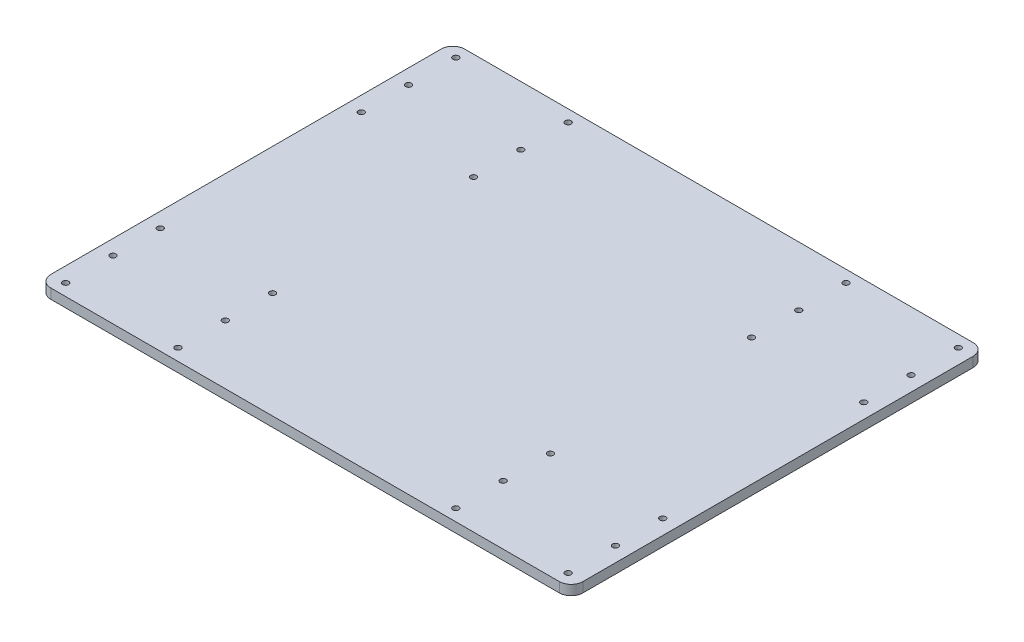
ISO-10303-21;
HEADER;
FILE_DESCRIPTION(('STEP AP214'),'2;1');
FILE_NAME('part.step','',(''),(''),'','','');
FILE_SCHEMA(('AUTOMOTIVE_DESIGN { 1 0 10303 214 1 1 1 1 }'));
ENDSEC;
DATA;
#1=APPLICATION_CONTEXT('core data for automotive mechanical design processes');
#2=APPLICATION_PROTOCOL_DEFINITION('international standard','automotive_design',2000,#1);
#3=PRODUCT_CONTEXT('',#1,'mechanical');
#4=PRODUCT('Part','Part','',(#3));
#5=PRODUCT_RELATED_PRODUCT_CATEGORY('part','',(#4));
#6=PRODUCT_DEFINITION_FORMATION('','',#4);
#7=PRODUCT_DEFINITION_CONTEXT('part definition',#1,'design');
#8=PRODUCT_DEFINITION('design','',#6,#7);
#9=PRODUCT_DEFINITION_SHAPE('','',#8);
#10=(LENGTH_UNIT() NAMED_UNIT(*) SI_UNIT(.MILLI.,.METRE.));
#11=(NAMED_UNIT(*) PLANE_ANGLE_UNIT() SI_UNIT($,.RADIAN.));
#12=(NAMED_UNIT(*) SI_UNIT($,.STERADIAN.) SOLID_ANGLE_UNIT());
#13=UNCERTAINTY_MEASURE_WITH_UNIT(LENGTH_MEASURE(1.E-05),#10,'distance_accuracy_value','');
#14=(GEOMETRIC_REPRESENTATION_CONTEXT(3) GLOBAL_UNCERTAINTY_ASSIGNED_CONTEXT((#13)) GLOBAL_UNIT_ASSIGNED_CONTEXT((#10,
#11,#12)) REPRESENTATION_CONTEXT('',''));
#15=CARTESIAN_POINT('',(0.,0.,0.));
#16=DIRECTION('',(0.,0.,1.));
#17=DIRECTION('',(1.,0.,0.));
#18=AXIS2_PLACEMENT_3D('',#15,#16,#17);
#19=CARTESIAN_POINT('',(129.,5.,-99.));
#20=DIRECTION('',(0.,-1.,0.));
#21=DIRECTION('',(0.,0.,-1.));
#22=AXIS2_PLACEMENT_3D('',#19,#20,#21);
#23=PLANE('',#22);
#24=CARTESIAN_POINT('',(129.,5.,-99.));
#25=DIRECTION('',(0.,1.,0.));
#26=DIRECTION('',(0.,0.,-1.));
#27=AXIS2_PLACEMENT_3D('',#24,#25,#26);
#28=CIRCLE('',#27,5.99999999999998);
#29=CARTESIAN_POINT('',(135.,5.,-99.));
#30=VERTEX_POINT('',#29);
#31=CARTESIAN_POINT('',(129.,5.,-105.));
#32=VERTEX_POINT('',#31);
#33=EDGE_CURVE('E151',#30,#32,#28,.T.);
#34=ORIENTED_EDGE('',*,*,#33,.T.);
#35=DIRECTION('',(-1.,0.,0.));
#36=VECTOR('',#35,1.);
#37=CARTESIAN_POINT('',(-129.,5.,-105.));
#38=LINE('',#37,#36);
#39=CARTESIAN_POINT('',(-129.,5.,-105.));
#40=VERTEX_POINT('',#39);
#41=EDGE_CURVE('E99',#32,#40,#38,.T.);
#42=ORIENTED_EDGE('',*,*,#41,.T.);
#43=CARTESIAN_POINT('',(-129.,5.,-99.));
#44=DIRECTION('',(0.,1.,0.));
#45=DIRECTION('',(0.,0.,-1.));
#46=AXIS2_PLACEMENT_3D('',#43,#44,#45);
#47=CIRCLE('',#46,5.99999999999998);
#48=CARTESIAN_POINT('',(-135.,5.,-99.));
#49=VERTEX_POINT('',#48);
#50=EDGE_CURVE('E166',#40,#49,#47,.T.);
#51=ORIENTED_EDGE('',*,*,#50,.T.);
#52=DIRECTION('',(0.,0.,1.));
#53=VECTOR('',#52,1.);
#54=CARTESIAN_POINT('',(-135.,5.,99.));
#55=LINE('',#54,#53);
#56=CARTESIAN_POINT('',(-135.,5.,99.));
#57=VERTEX_POINT('',#56);
#58=EDGE_CURVE('E179',#49,#57,#55,.T.);
#59=ORIENTED_EDGE('',*,*,#58,.T.);
#60=CARTESIAN_POINT('',(-129.,5.,99.));
#61=DIRECTION('',(0.,1.,0.));
#62=DIRECTION('',(0.,0.,-1.));
#63=AXIS2_PLACEMENT_3D('',#60,#61,#62);
#64=CIRCLE('',#63,5.99999999999996);
#65=CARTESIAN_POINT('',(-129.,5.,105.));
#66=VERTEX_POINT('',#65);
#67=EDGE_CURVE('E118',#57,#66,#64,.T.);
#68=ORIENTED_EDGE('',*,*,#67,.T.);
#69=DIRECTION('',(1.,0.,0.));
#70=VECTOR('',#69,1.);
#71=CARTESIAN_POINT('',(-129.,5.,105.));
#72=LINE('',#71,#70);
#73=CARTESIAN_POINT('',(129.,5.,105.));
#74=VERTEX_POINT('',#73);
#75=EDGE_CURVE('E112',#66,#74,#72,.T.);
#76=ORIENTED_EDGE('',*,*,#75,.T.);
#77=CARTESIAN_POINT('',(129.,5.,99.));
#78=DIRECTION('',(0.,1.,0.));
#79=DIRECTION('',(0.,0.,-1.));
#80=AXIS2_PLACEMENT_3D('',#77,#78,#79);
#81=CIRCLE('',#80,5.99999999999998);
#82=CARTESIAN_POINT('',(135.,5.,99.));
#83=VERTEX_POINT('',#82);
#84=EDGE_CURVE('E116',#74,#83,#81,.T.);
#85=ORIENTED_EDGE('',*,*,#84,.T.);
#86=DIRECTION('',(0.,0.,-1.));
#87=VECTOR('',#86,1.);
#88=CARTESIAN_POINT('',(135.,5.,99.));
#89=LINE('',#88,#87);
#90=EDGE_CURVE('E56',#83,#30,#89,.T.);
#91=ORIENTED_EDGE('',*,*,#90,.T.);
#92=EDGE_LOOP('',(#34,#42,#51,#59,#68,#76,#85,#91));
#93=FACE_BOUND('',#92,.T.);
#94=CARTESIAN_POINT('',(-127.5,5.,-99.));
#95=DIRECTION('',(0.,1.,0.));
#96=DIRECTION('',(0.,0.,1.));
#97=AXIS2_PLACEMENT_3D('',#94,#95,#96);
#98=CIRCLE('',#97,1.5);
#99=CARTESIAN_POINT('',(-127.5,5.,-97.5));
#100=VERTEX_POINT('',#99);
#101=EDGE_CURVE('E140',#100,#100,#98,.T.);
#102=ORIENTED_EDGE('',*,*,#101,.F.);
#103=EDGE_LOOP('',(#102));
#104=FACE_BOUND('',#103,.T.);
#105=CARTESIAN_POINT('',(-127.5,5.,-75.));
#106=DIRECTION('',(0.,1.,0.));
#107=DIRECTION('',(0.,0.,1.));
#108=AXIS2_PLACEMENT_3D('',#105,#106,#107);
#109=CIRCLE('',#108,1.5);
#110=CARTESIAN_POINT('',(-127.5,5.,-73.5));
#111=VERTEX_POINT('',#110);
#112=EDGE_CURVE('E188',#111,#111,#109,.T.);
#113=ORIENTED_EDGE('',*,*,#112,.F.);
#114=EDGE_LOOP('',(#113));
#115=FACE_BOUND('',#114,.T.);
#116=CARTESIAN_POINT('',(-127.5,5.,-51.));
#117=DIRECTION('',(0.,1.,0.));
#118=DIRECTION('',(0.,0.,1.));
#119=AXIS2_PLACEMENT_3D('',#116,#117,#118);
#120=CIRCLE('',#119,1.5);
#121=CARTESIAN_POINT('',(-127.5,5.,-49.5));
#122=VERTEX_POINT('',#121);
#123=EDGE_CURVE('E194',#122,#122,#120,.T.);
#124=ORIENTED_EDGE('',*,*,#123,.F.);
#125=EDGE_LOOP('',(#124));
#126=FACE_BOUND('',#125,.T.);
#127=CARTESIAN_POINT('',(-70.5,5.,-99.));
#128=DIRECTION('',(0.,1.,0.));
#129=DIRECTION('',(0.,0.,1.));
#130=AXIS2_PLACEMENT_3D('',#127,#128,#129);
#131=CIRCLE('',#130,1.5);
#132=CARTESIAN_POINT('',(-70.5,5.,-97.5));
#133=VERTEX_POINT('',#132);
#134=EDGE_CURVE('E200',#133,#133,#131,.T.);
#135=ORIENTED_EDGE('',*,*,#134,.F.);
#136=EDGE_LOOP('',(#135));
#137=FACE_BOUND('',#136,.T.);
#138=CARTESIAN_POINT('',(-70.4999999999998,5.,-75.));
#139=DIRECTION('',(0.,1.,0.));
#140=DIRECTION('',(0.,0.,1.));
#141=AXIS2_PLACEMENT_3D('',#138,#139,#140);
#142=CIRCLE('',#141,1.5);
#143=CARTESIAN_POINT('',(-70.4999999999998,5.,-73.5));
#144=VERTEX_POINT('',#143);
#145=EDGE_CURVE('E206',#144,#144,#142,.T.);
#146=ORIENTED_EDGE('',*,*,#145,.F.);
#147=EDGE_LOOP('',(#146));
#148=FACE_BOUND('',#147,.T.);
#149=CARTESIAN_POINT('',(-70.4999999999995,5.,-51.));
#150=DIRECTION('',(0.,1.,0.));
#151=DIRECTION('',(0.,0.,1.));
#152=AXIS2_PLACEMENT_3D('',#149,#150,#151);
#153=CIRCLE('',#152,1.5);
#154=CARTESIAN_POINT('',(-70.4999999999995,5.,-49.5));
#155=VERTEX_POINT('',#154);
#156=EDGE_CURVE('E212',#155,#155,#153,.T.);
#157=ORIENTED_EDGE('',*,*,#156,.F.);
#158=EDGE_LOOP('',(#157));
#159=FACE_BOUND('',#158,.T.);
#160=CARTESIAN_POINT('',(70.4999999999995,5.,-51.));
#161=DIRECTION('',(0.,1.,0.));
#162=DIRECTION('',(0.,0.,-1.));
#163=AXIS2_PLACEMENT_3D('',#160,#161,#162);
#164=CIRCLE('',#163,1.5);
#165=CARTESIAN_POINT('',(70.4999999999995,5.,-52.5));
#166=VERTEX_POINT('',#165);
#167=EDGE_CURVE('E218',#166,#166,#164,.T.);
#168=ORIENTED_EDGE('',*,*,#167,.F.);
#169=EDGE_LOOP('',(#168));
#170=FACE_BOUND('',#169,.T.);
#171=CARTESIAN_POINT('',(70.4999999999998,5.,-75.));
#172=DIRECTION('',(0.,1.,0.));
#173=DIRECTION('',(0.,0.,-1.));
#174=AXIS2_PLACEMENT_3D('',#171,#172,#173);
#175=CIRCLE('',#174,1.5);
#176=CARTESIAN_POINT('',(70.4999999999998,5.,-76.5));
#177=VERTEX_POINT('',#176);
#178=EDGE_CURVE('E224',#177,#177,#175,.T.);
#179=ORIENTED_EDGE('',*,*,#178,.F.);
#180=EDGE_LOOP('',(#179));
#181=FACE_BOUND('',#180,.T.);
#182=CARTESIAN_POINT('',(70.5,5.,-99.));
#183=DIRECTION('',(0.,1.,0.));
#184=DIRECTION('',(0.,0.,-1.));
#185=AXIS2_PLACEMENT_3D('',#182,#183,#184);
#186=CIRCLE('',#185,1.5);
#187=CARTESIAN_POINT('',(70.5,5.,-100.5));
#188=VERTEX_POINT('',#187);
#189=EDGE_CURVE('E230',#188,#188,#186,.T.);
#190=ORIENTED_EDGE('',*,*,#189,.F.);
#191=EDGE_LOOP('',(#190));
#192=FACE_BOUND('',#191,.T.);
#193=CARTESIAN_POINT('',(127.5,5.,-51.));
#194=DIRECTION('',(0.,1.,0.));
#195=DIRECTION('',(0.,0.,-1.));
#196=AXIS2_PLACEMENT_3D('',#193,#194,#195);
#197=CIRCLE('',#196,1.5);
#198=CARTESIAN_POINT('',(127.5,5.,-52.5));
#199=VERTEX_POINT('',#198);
#200=EDGE_CURVE('E236',#199,#199,#197,.T.);
#201=ORIENTED_EDGE('',*,*,#200,.F.);
#202=EDGE_LOOP('',(#201));
#203=FACE_BOUND('',#202,.T.);
#204=CARTESIAN_POINT('',(127.5,5.,-75.));
#205=DIRECTION('',(0.,1.,0.));
#206=DIRECTION('',(0.,0.,-1.));
#207=AXIS2_PLACEMENT_3D('',#204,#205,#206);
#208=CIRCLE('',#207,1.5);
#209=CARTESIAN_POINT('',(127.5,5.,-76.5));
#210=VERTEX_POINT('',#209);
#211=EDGE_CURVE('E242',#210,#210,#208,.T.);
#212=ORIENTED_EDGE('',*,*,#211,.F.);
#213=EDGE_LOOP('',(#212));
#214=FACE_BOUND('',#213,.T.);
#215=CARTESIAN_POINT('',(127.5,5.,-99.));
#216=DIRECTION('',(0.,1.,0.));
#217=DIRECTION('',(0.,0.,-1.));
#218=AXIS2_PLACEMENT_3D('',#215,#216,#217);
#219=CIRCLE('',#218,1.5);
#220=CARTESIAN_POINT('',(127.5,5.,-100.5));
#221=VERTEX_POINT('',#220);
#222=EDGE_CURVE('E248',#221,#221,#219,.T.);
#223=ORIENTED_EDGE('',*,*,#222,.F.);
#224=EDGE_LOOP('',(#223));
#225=FACE_BOUND('',#224,.T.);
#226=CARTESIAN_POINT('',(127.5,5.,99.));
#227=DIRECTION('',(0.,1.,0.));
#228=DIRECTION('',(0.,0.,1.));
#229=AXIS2_PLACEMENT_3D('',#226,#227,#228);
#230=CIRCLE('',#229,1.5);
#231=CARTESIAN_POINT('',(127.5,5.,100.5));
#232=VERTEX_POINT('',#231);
#233=EDGE_CURVE('E254',#232,#232,#230,.T.);
#234=ORIENTED_EDGE('',*,*,#233,.F.);
#235=EDGE_LOOP('',(#234));
#236=FACE_BOUND('',#235,.T.);
#237=CARTESIAN_POINT('',(127.5,5.,75.));
#238=DIRECTION('',(0.,1.,0.));
#239=DIRECTION('',(0.,0.,1.));
#240=AXIS2_PLACEMENT_3D('',#237,#238,#239);
#241=CIRCLE('',#240,1.5);
#242=CARTESIAN_POINT('',(127.5,5.,76.5));
#243=VERTEX_POINT('',#242);
#244=EDGE_CURVE('E260',#243,#243,#241,.T.);
#245=ORIENTED_EDGE('',*,*,#244,.F.);
#246=EDGE_LOOP('',(#245));
#247=FACE_BOUND('',#246,.T.);
#248=CARTESIAN_POINT('',(127.5,5.,51.));
#249=DIRECTION('',(0.,1.,0.));
#250=DIRECTION('',(0.,0.,1.));
#251=AXIS2_PLACEMENT_3D('',#248,#249,#250);
#252=CIRCLE('',#251,1.5);
#253=CARTESIAN_POINT('',(127.5,5.,52.5));
#254=VERTEX_POINT('',#253);
#255=EDGE_CURVE('E266',#254,#254,#252,.T.);
#256=ORIENTED_EDGE('',*,*,#255,.F.);
#257=EDGE_LOOP('',(#256));
#258=FACE_BOUND('',#257,.T.);
#259=CARTESIAN_POINT('',(70.5,5.,99.));
#260=DIRECTION('',(0.,1.,0.));
#261=DIRECTION('',(0.,0.,1.));
#262=AXIS2_PLACEMENT_3D('',#259,#260,#261);
#263=CIRCLE('',#262,1.5);
#264=CARTESIAN_POINT('',(70.5,5.,100.5));
#265=VERTEX_POINT('',#264);
#266=EDGE_CURVE('E272',#265,#265,#263,.T.);
#267=ORIENTED_EDGE('',*,*,#266,.F.);
#268=EDGE_LOOP('',(#267));
#269=FACE_BOUND('',#268,.T.);
#270=CARTESIAN_POINT('',(70.4999999999998,5.,75.));
#271=DIRECTION('',(0.,1.,0.));
#272=DIRECTION('',(0.,0.,1.));
#273=AXIS2_PLACEMENT_3D('',#270,#271,#272);
#274=CIRCLE('',#273,1.5);
#275=CARTESIAN_POINT('',(70.4999999999998,5.,76.5));
#276=VERTEX_POINT('',#275);
#277=EDGE_CURVE('E278',#276,#276,#274,.T.);
#278=ORIENTED_EDGE('',*,*,#277,.F.);
#279=EDGE_LOOP('',(#278));
#280=FACE_BOUND('',#279,.T.);
#281=CARTESIAN_POINT('',(70.4999999999995,5.,51.));
#282=DIRECTION('',(0.,1.,0.));
#283=DIRECTION('',(0.,0.,1.));
#284=AXIS2_PLACEMENT_3D('',#281,#282,#283);
#285=CIRCLE('',#284,1.5);
#286=CARTESIAN_POINT('',(70.4999999999995,5.,52.5));
#287=VERTEX_POINT('',#286);
#288=EDGE_CURVE('E284',#287,#287,#285,.T.);
#289=ORIENTED_EDGE('',*,*,#288,.F.);
#290=EDGE_LOOP('',(#289));
#291=FACE_BOUND('',#290,.T.);
#292=CARTESIAN_POINT('',(-70.4999999999995,5.,51.));
#293=DIRECTION('',(0.,1.,0.));
#294=DIRECTION('',(0.,0.,-1.));
#295=AXIS2_PLACEMENT_3D('',#292,#293,#294);
#296=CIRCLE('',#295,1.5);
#297=CARTESIAN_POINT('',(-70.4999999999995,5.,49.5));
#298=VERTEX_POINT('',#297);
#299=EDGE_CURVE('E290',#298,#298,#296,.T.);
#300=ORIENTED_EDGE('',*,*,#299,.F.);
#301=EDGE_LOOP('',(#300));
#302=FACE_BOUND('',#301,.T.);
#303=CARTESIAN_POINT('',(-70.4999999999998,5.,75.));
#304=DIRECTION('',(0.,1.,0.));
#305=DIRECTION('',(0.,0.,-1.));
#306=AXIS2_PLACEMENT_3D('',#303,#304,#305);
#307=CIRCLE('',#306,1.5);
#308=CARTESIAN_POINT('',(-70.4999999999998,5.,73.5));
#309=VERTEX_POINT('',#308);
#310=EDGE_CURVE('E296',#309,#309,#307,.T.);
#311=ORIENTED_EDGE('',*,*,#310,.F.);
#312=EDGE_LOOP('',(#311));
#313=FACE_BOUND('',#312,.T.);
#314=CARTESIAN_POINT('',(-70.5,5.,99.));
#315=DIRECTION('',(0.,1.,0.));
#316=DIRECTION('',(0.,0.,-1.));
#317=AXIS2_PLACEMENT_3D('',#314,#315,#316);
#318=CIRCLE('',#317,1.5);
#319=CARTESIAN_POINT('',(-70.5,5.,97.5));
#320=VERTEX_POINT('',#319);
#321=EDGE_CURVE('E302',#320,#320,#318,.T.);
#322=ORIENTED_EDGE('',*,*,#321,.F.);
#323=EDGE_LOOP('',(#322));
#324=FACE_BOUND('',#323,.T.);
#325=CARTESIAN_POINT('',(-127.5,5.,51.));
#326=DIRECTION('',(0.,1.,0.));
#327=DIRECTION('',(0.,0.,-1.));
#328=AXIS2_PLACEMENT_3D('',#325,#326,#327);
#329=CIRCLE('',#328,1.5);
#330=CARTESIAN_POINT('',(-127.5,5.,49.5));
#331=VERTEX_POINT('',#330);
#332=EDGE_CURVE('E308',#331,#331,#329,.T.);
#333=ORIENTED_EDGE('',*,*,#332,.F.);
#334=EDGE_LOOP('',(#333));
#335=FACE_BOUND('',#334,.T.);
#336=CARTESIAN_POINT('',(-127.5,5.,75.));
#337=DIRECTION('',(0.,1.,0.));
#338=DIRECTION('',(0.,0.,-1.));
#339=AXIS2_PLACEMENT_3D('',#336,#337,#338);
#340=CIRCLE('',#339,1.5);
#341=CARTESIAN_POINT('',(-127.5,5.,73.5));
#342=VERTEX_POINT('',#341);
#343=EDGE_CURVE('E314',#342,#342,#340,.T.);
#344=ORIENTED_EDGE('',*,*,#343,.F.);
#345=EDGE_LOOP('',(#344));
#346=FACE_BOUND('',#345,.T.);
#347=CARTESIAN_POINT('',(-127.5,5.,99.));
#348=DIRECTION('',(0.,1.,0.));
#349=DIRECTION('',(0.,0.,-1.));
#350=AXIS2_PLACEMENT_3D('',#347,#348,#349);
#351=CIRCLE('',#350,1.5);
#352=CARTESIAN_POINT('',(-127.5,5.,97.5));
#353=VERTEX_POINT('',#352);
#354=EDGE_CURVE('E320',#353,#353,#351,.T.);
#355=ORIENTED_EDGE('',*,*,#354,.F.);
#356=EDGE_LOOP('',(#355));
#357=FACE_BOUND('',#356,.T.);
#358=ADVANCED_FACE('F39',(#93,#104,#115,#126,#137,#148,#159,#170,#181,#192,#203,#214,#225,#236,
#247,#258,#269,#280,#291,#302,#313,#324,#335,#346,#357),#23,.F.);
#359=CARTESIAN_POINT('',(129.,0.,-99.));
#360=DIRECTION('',(0.,-1.,0.));
#361=DIRECTION('',(0.,0.,-1.));
#362=AXIS2_PLACEMENT_3D('',#359,#360,#361);
#363=PLANE('',#362);
#364=CARTESIAN_POINT('',(-127.5,0.,75.));
#365=DIRECTION('',(0.,1.,0.));
#366=DIRECTION('',(0.,0.,-1.));
#367=AXIS2_PLACEMENT_3D('',#364,#365,#366);
#368=CIRCLE('',#367,1.5);
#369=CARTESIAN_POINT('',(-127.5,0.,73.5));
#370=VERTEX_POINT('',#369);
#371=EDGE_CURVE('E317',#370,#370,#368,.T.);
#372=ORIENTED_EDGE('',*,*,#371,.T.);
#373=EDGE_LOOP('',(#372));
#374=FACE_BOUND('',#373,.T.);
#375=CARTESIAN_POINT('',(-70.5,0.,99.));
#376=DIRECTION('',(0.,1.,0.));
#377=DIRECTION('',(0.,0.,-1.));
#378=AXIS2_PLACEMENT_3D('',#375,#376,#377);
#379=CIRCLE('',#378,1.5);
#380=CARTESIAN_POINT('',(-70.5,0.,97.5));
#381=VERTEX_POINT('',#380);
#382=EDGE_CURVE('E305',#381,#381,#379,.T.);
#383=ORIENTED_EDGE('',*,*,#382,.T.);
#384=EDGE_LOOP('',(#383));
#385=FACE_BOUND('',#384,.T.);
#386=CARTESIAN_POINT('',(-70.4999999999995,0.,51.));
#387=DIRECTION('',(0.,1.,0.));
#388=DIRECTION('',(0.,0.,-1.));
#389=AXIS2_PLACEMENT_3D('',#386,#387,#388);
#390=CIRCLE('',#389,1.5);
#391=CARTESIAN_POINT('',(-70.4999999999995,0.,49.5));
#392=VERTEX_POINT('',#391);
#393=EDGE_CURVE('E293',#392,#392,#390,.T.);
#394=ORIENTED_EDGE('',*,*,#393,.T.);
#395=EDGE_LOOP('',(#394));
#396=FACE_BOUND('',#395,.T.);
#397=CARTESIAN_POINT('',(70.4999999999998,0.,75.));
#398=DIRECTION('',(0.,1.,0.));
#399=DIRECTION('',(0.,0.,1.));
#400=AXIS2_PLACEMENT_3D('',#397,#398,#399);
#401=CIRCLE('',#400,1.5);
#402=CARTESIAN_POINT('',(70.4999999999998,0.,76.5));
#403=VERTEX_POINT('',#402);
#404=EDGE_CURVE('E281',#403,#403,#401,.T.);
#405=ORIENTED_EDGE('',*,*,#404,.T.);
#406=EDGE_LOOP('',(#405));
#407=FACE_BOUND('',#406,.T.);
#408=CARTESIAN_POINT('',(127.5,0.,51.));
#409=DIRECTION('',(0.,1.,0.));
#410=DIRECTION('',(0.,0.,1.));
#411=AXIS2_PLACEMENT_3D('',#408,#409,#410);
#412=CIRCLE('',#411,1.5);
#413=CARTESIAN_POINT('',(127.5,0.,52.5));
#414=VERTEX_POINT('',#413);
#415=EDGE_CURVE('E269',#414,#414,#412,.T.);
#416=ORIENTED_EDGE('',*,*,#415,.T.);
#417=EDGE_LOOP('',(#416));
#418=FACE_BOUND('',#417,.T.);
#419=CARTESIAN_POINT('',(127.5,0.,99.));
#420=DIRECTION('',(0.,1.,0.));
#421=DIRECTION('',(0.,0.,1.));
#422=AXIS2_PLACEMENT_3D('',#419,#420,#421);
#423=CIRCLE('',#422,1.5);
#424=CARTESIAN_POINT('',(127.5,0.,100.5));
#425=VERTEX_POINT('',#424);
#426=EDGE_CURVE('E257',#425,#425,#423,.T.);
#427=ORIENTED_EDGE('',*,*,#426,.T.);
#428=EDGE_LOOP('',(#427));
#429=FACE_BOUND('',#428,.T.);
#430=CARTESIAN_POINT('',(127.5,0.,-75.));
#431=DIRECTION('',(0.,1.,0.));
#432=DIRECTION('',(0.,0.,-1.));
#433=AXIS2_PLACEMENT_3D('',#430,#431,#432);
#434=CIRCLE('',#433,1.5);
#435=CARTESIAN_POINT('',(127.5,0.,-76.5));
#436=VERTEX_POINT('',#435);
#437=EDGE_CURVE('E245',#436,#436,#434,.T.);
#438=ORIENTED_EDGE('',*,*,#437,.T.);
#439=EDGE_LOOP('',(#438));
#440=FACE_BOUND('',#439,.T.);
#441=CARTESIAN_POINT('',(70.5,0.,-99.));
#442=DIRECTION('',(0.,1.,0.));
#443=DIRECTION('',(0.,0.,-1.));
#444=AXIS2_PLACEMENT_3D('',#441,#442,#443);
#445=CIRCLE('',#444,1.5);
#446=CARTESIAN_POINT('',(70.5,0.,-100.5));
#447=VERTEX_POINT('',#446);
#448=EDGE_CURVE('E233',#447,#447,#445,.T.);
#449=ORIENTED_EDGE('',*,*,#448,.T.);
#450=EDGE_LOOP('',(#449));
#451=FACE_BOUND('',#450,.T.);
#452=CARTESIAN_POINT('',(70.4999999999995,0.,-51.));
#453=DIRECTION('',(0.,1.,0.));
#454=DIRECTION('',(0.,0.,-1.));
#455=AXIS2_PLACEMENT_3D('',#452,#453,#454);
#456=CIRCLE('',#455,1.5);
#457=CARTESIAN_POINT('',(70.4999999999995,0.,-52.5));
#458=VERTEX_POINT('',#457);
#459=EDGE_CURVE('E221',#458,#458,#456,.T.);
#460=ORIENTED_EDGE('',*,*,#459,.T.);
#461=EDGE_LOOP('',(#460));
#462=FACE_BOUND('',#461,.T.);
#463=CARTESIAN_POINT('',(-70.4999999999998,0.,-75.));
#464=DIRECTION('',(0.,1.,0.));
#465=DIRECTION('',(0.,0.,1.));
#466=AXIS2_PLACEMENT_3D('',#463,#464,#465);
#467=CIRCLE('',#466,1.5);
#468=CARTESIAN_POINT('',(-70.4999999999998,0.,-73.5));
#469=VERTEX_POINT('',#468);
#470=EDGE_CURVE('E209',#469,#469,#467,.T.);
#471=ORIENTED_EDGE('',*,*,#470,.T.);
#472=EDGE_LOOP('',(#471));
#473=FACE_BOUND('',#472,.T.);
#474=CARTESIAN_POINT('',(-127.5,0.,-51.));
#475=DIRECTION('',(0.,1.,0.));
#476=DIRECTION('',(0.,0.,1.));
#477=AXIS2_PLACEMENT_3D('',#474,#475,#476);
#478=CIRCLE('',#477,1.5);
#479=CARTESIAN_POINT('',(-127.5,0.,-49.5));
#480=VERTEX_POINT('',#479);
#481=EDGE_CURVE('E197',#480,#480,#478,.T.);
#482=ORIENTED_EDGE('',*,*,#481,.T.);
#483=EDGE_LOOP('',(#482));
#484=FACE_BOUND('',#483,.T.);
#485=CARTESIAN_POINT('',(-127.5,0.,-99.));
#486=DIRECTION('',(0.,1.,0.));
#487=DIRECTION('',(0.,0.,1.));
#488=AXIS2_PLACEMENT_3D('',#485,#486,#487);
#489=CIRCLE('',#488,1.5);
#490=CARTESIAN_POINT('',(-127.5,0.,-97.5));
#491=VERTEX_POINT('',#490);
#492=EDGE_CURVE('E185',#491,#491,#489,.T.);
#493=ORIENTED_EDGE('',*,*,#492,.T.);
#494=EDGE_LOOP('',(#493));
#495=FACE_BOUND('',#494,.T.);
#496=CARTESIAN_POINT('',(129.,0.,-99.));
#497=DIRECTION('',(0.,1.,0.));
#498=DIRECTION('',(0.,0.,-1.));
#499=AXIS2_PLACEMENT_3D('',#496,#497,#498);
#500=CIRCLE('',#499,5.99999999999998);
#501=CARTESIAN_POINT('',(135.,0.,-99.));
#502=VERTEX_POINT('',#501);
#503=CARTESIAN_POINT('',(129.,0.,-105.));
#504=VERTEX_POINT('',#503);
#505=EDGE_CURVE('E136',#502,#504,#500,.T.);
#506=ORIENTED_EDGE('',*,*,#505,.F.);
#507=DIRECTION('',(0.,0.,-1.));
#508=VECTOR('',#507,1.);
#509=CARTESIAN_POINT('',(135.,0.,99.));
#510=LINE('',#509,#508);
#511=CARTESIAN_POINT('',(135.,0.,99.));
#512=VERTEX_POINT('',#511);
#513=EDGE_CURVE('E91',#512,#502,#510,.T.);
#514=ORIENTED_EDGE('',*,*,#513,.F.);
#515=CARTESIAN_POINT('',(129.,0.,99.));
#516=DIRECTION('',(0.,1.,0.));
#517=DIRECTION('',(0.,0.,-1.));
#518=AXIS2_PLACEMENT_3D('',#515,#516,#517);
#519=CIRCLE('',#518,5.99999999999998);
#520=CARTESIAN_POINT('',(129.,0.,105.));
#521=VERTEX_POINT('',#520);
#522=EDGE_CURVE('E85',#521,#512,#519,.T.);
#523=ORIENTED_EDGE('',*,*,#522,.F.);
#524=DIRECTION('',(1.,0.,0.));
#525=VECTOR('',#524,1.);
#526=CARTESIAN_POINT('',(-129.,0.,105.));
#527=LINE('',#526,#525);
#528=CARTESIAN_POINT('',(-129.,0.,105.));
#529=VERTEX_POINT('',#528);
#530=EDGE_CURVE('E126',#529,#521,#527,.T.);
#531=ORIENTED_EDGE('',*,*,#530,.F.);
#532=CARTESIAN_POINT('',(-129.,0.,99.));
#533=DIRECTION('',(0.,1.,0.));
#534=DIRECTION('',(0.,0.,-1.));
#535=AXIS2_PLACEMENT_3D('',#532,#533,#534);
#536=CIRCLE('',#535,5.99999999999996);
#537=CARTESIAN_POINT('',(-135.,0.,99.));
#538=VERTEX_POINT('',#537);
#539=EDGE_CURVE('E146',#538,#529,#536,.T.);
#540=ORIENTED_EDGE('',*,*,#539,.F.);
#541=DIRECTION('',(0.,0.,1.));
#542=VECTOR('',#541,1.);
#543=CARTESIAN_POINT('',(-135.,0.,99.));
#544=LINE('',#543,#542);
#545=CARTESIAN_POINT('',(-135.,0.,-99.));
#546=VERTEX_POINT('',#545);
#547=EDGE_CURVE('E144',#546,#538,#544,.T.);
#548=ORIENTED_EDGE('',*,*,#547,.F.);
#549=CARTESIAN_POINT('',(-129.,0.,-99.));
#550=DIRECTION('',(0.,1.,0.));
#551=DIRECTION('',(0.,0.,-1.));
#552=AXIS2_PLACEMENT_3D('',#549,#550,#551);
#553=CIRCLE('',#552,5.99999999999998);
#554=CARTESIAN_POINT('',(-129.,0.,-105.));
#555=VERTEX_POINT('',#554);
#556=EDGE_CURVE('E142',#555,#546,#553,.T.);
#557=ORIENTED_EDGE('',*,*,#556,.F.);
#558=DIRECTION('',(-1.,0.,0.));
#559=VECTOR('',#558,1.);
#560=CARTESIAN_POINT('',(-129.,0.,-105.));
#561=LINE('',#560,#559);
#562=EDGE_CURVE('E139',#504,#555,#561,.T.);
#563=ORIENTED_EDGE('',*,*,#562,.F.);
#564=EDGE_LOOP('',(#506,#514,#523,#531,#540,#548,#557,#563));
#565=FACE_BOUND('',#564,.T.);
#566=CARTESIAN_POINT('',(-127.5,0.,-75.));
#567=DIRECTION('',(0.,1.,0.));
#568=DIRECTION('',(0.,0.,1.));
#569=AXIS2_PLACEMENT_3D('',#566,#567,#568);
#570=CIRCLE('',#569,1.5);
#571=CARTESIAN_POINT('',(-127.5,0.,-73.5));
#572=VERTEX_POINT('',#571);
#573=EDGE_CURVE('E191',#572,#572,#570,.T.);
#574=ORIENTED_EDGE('',*,*,#573,.T.);
#575=EDGE_LOOP('',(#574));
#576=FACE_BOUND('',#575,.T.);
#577=CARTESIAN_POINT('',(-70.5,0.,-99.));
#578=DIRECTION('',(0.,1.,0.));
#579=DIRECTION('',(0.,0.,1.));
#580=AXIS2_PLACEMENT_3D('',#577,#578,#579);
#581=CIRCLE('',#580,1.5);
#582=CARTESIAN_POINT('',(-70.5,0.,-97.5));
#583=VERTEX_POINT('',#582);
#584=EDGE_CURVE('E203',#583,#583,#581,.T.);
#585=ORIENTED_EDGE('',*,*,#584,.T.);
#586=EDGE_LOOP('',(#585));
#587=FACE_BOUND('',#586,.T.);
#588=CARTESIAN_POINT('',(-70.4999999999995,0.,-51.));
#589=DIRECTION('',(0.,1.,0.));
#590=DIRECTION('',(0.,0.,1.));
#591=AXIS2_PLACEMENT_3D('',#588,#589,#590);
#592=CIRCLE('',#591,1.5);
#593=CARTESIAN_POINT('',(-70.4999999999995,0.,-49.5));
#594=VERTEX_POINT('',#593);
#595=EDGE_CURVE('E215',#594,#594,#592,.T.);
#596=ORIENTED_EDGE('',*,*,#595,.T.);
#597=EDGE_LOOP('',(#596));
#598=FACE_BOUND('',#597,.T.);
#599=CARTESIAN_POINT('',(70.4999999999998,0.,-75.));
#600=DIRECTION('',(0.,1.,0.));
#601=DIRECTION('',(0.,0.,-1.));
#602=AXIS2_PLACEMENT_3D('',#599,#600,#601);
#603=CIRCLE('',#602,1.5);
#604=CARTESIAN_POINT('',(70.4999999999998,0.,-76.5));
#605=VERTEX_POINT('',#604);
#606=EDGE_CURVE('E227',#605,#605,#603,.T.);
#607=ORIENTED_EDGE('',*,*,#606,.T.);
#608=EDGE_LOOP('',(#607));
#609=FACE_BOUND('',#608,.T.);
#610=CARTESIAN_POINT('',(127.5,0.,-51.));
#611=DIRECTION('',(0.,1.,0.));
#612=DIRECTION('',(0.,0.,-1.));
#613=AXIS2_PLACEMENT_3D('',#610,#611,#612);
#614=CIRCLE('',#613,1.5);
#615=CARTESIAN_POINT('',(127.5,0.,-52.5));
#616=VERTEX_POINT('',#615);
#617=EDGE_CURVE('E239',#616,#616,#614,.T.);
#618=ORIENTED_EDGE('',*,*,#617,.T.);
#619=EDGE_LOOP('',(#618));
#620=FACE_BOUND('',#619,.T.);
#621=CARTESIAN_POINT('',(127.5,0.,-99.));
#622=DIRECTION('',(0.,1.,0.));
#623=DIRECTION('',(0.,0.,-1.));
#624=AXIS2_PLACEMENT_3D('',#621,#622,#623);
#625=CIRCLE('',#624,1.5);
#626=CARTESIAN_POINT('',(127.5,0.,-100.5));
#627=VERTEX_POINT('',#626);
#628=EDGE_CURVE('E251',#627,#627,#625,.T.);
#629=ORIENTED_EDGE('',*,*,#628,.T.);
#630=EDGE_LOOP('',(#629));
#631=FACE_BOUND('',#630,.T.);
#632=CARTESIAN_POINT('',(127.5,0.,75.));
#633=DIRECTION('',(0.,1.,0.));
#634=DIRECTION('',(0.,0.,1.));
#635=AXIS2_PLACEMENT_3D('',#632,#633,#634);
#636=CIRCLE('',#635,1.5);
#637=CARTESIAN_POINT('',(127.5,0.,76.5));
#638=VERTEX_POINT('',#637);
#639=EDGE_CURVE('E263',#638,#638,#636,.T.);
#640=ORIENTED_EDGE('',*,*,#639,.T.);
#641=EDGE_LOOP('',(#640));
#642=FACE_BOUND('',#641,.T.);
#643=CARTESIAN_POINT('',(70.5,0.,99.));
#644=DIRECTION('',(0.,1.,0.));
#645=DIRECTION('',(0.,0.,1.));
#646=AXIS2_PLACEMENT_3D('',#643,#644,#645);
#647=CIRCLE('',#646,1.5);
#648=CARTESIAN_POINT('',(70.5,0.,100.5));
#649=VERTEX_POINT('',#648);
#650=EDGE_CURVE('E275',#649,#649,#647,.T.);
#651=ORIENTED_EDGE('',*,*,#650,.T.);
#652=EDGE_LOOP('',(#651));
#653=FACE_BOUND('',#652,.T.);
#654=CARTESIAN_POINT('',(70.4999999999995,0.,51.));
#655=DIRECTION('',(0.,1.,0.));
#656=DIRECTION('',(0.,0.,1.));
#657=AXIS2_PLACEMENT_3D('',#654,#655,#656);
#658=CIRCLE('',#657,1.5);
#659=CARTESIAN_POINT('',(70.4999999999995,0.,52.5));
#660=VERTEX_POINT('',#659);
#661=EDGE_CURVE('E287',#660,#660,#658,.T.);
#662=ORIENTED_EDGE('',*,*,#661,.T.);
#663=EDGE_LOOP('',(#662));
#664=FACE_BOUND('',#663,.T.);
#665=CARTESIAN_POINT('',(-70.4999999999998,0.,75.));
#666=DIRECTION('',(0.,1.,0.));
#667=DIRECTION('',(0.,0.,-1.));
#668=AXIS2_PLACEMENT_3D('',#665,#666,#667);
#669=CIRCLE('',#668,1.5);
#670=CARTESIAN_POINT('',(-70.4999999999998,0.,73.5));
#671=VERTEX_POINT('',#670);
#672=EDGE_CURVE('E299',#671,#671,#669,.T.);
#673=ORIENTED_EDGE('',*,*,#672,.T.);
#674=EDGE_LOOP('',(#673));
#675=FACE_BOUND('',#674,.T.);
#676=CARTESIAN_POINT('',(-127.5,0.,51.));
#677=DIRECTION('',(0.,1.,0.));
#678=DIRECTION('',(0.,0.,-1.));
#679=AXIS2_PLACEMENT_3D('',#676,#677,#678);
#680=CIRCLE('',#679,1.5);
#681=CARTESIAN_POINT('',(-127.5,0.,49.5));
#682=VERTEX_POINT('',#681);
#683=EDGE_CURVE('E311',#682,#682,#680,.T.);
#684=ORIENTED_EDGE('',*,*,#683,.T.);
#685=EDGE_LOOP('',(#684));
#686=FACE_BOUND('',#685,.T.);
#687=CARTESIAN_POINT('',(-127.5,0.,99.));
#688=DIRECTION('',(0.,1.,0.));
#689=DIRECTION('',(0.,0.,-1.));
#690=AXIS2_PLACEMENT_3D('',#687,#688,#689);
#691=CIRCLE('',#690,1.5);
#692=CARTESIAN_POINT('',(-127.5,0.,97.5));
#693=VERTEX_POINT('',#692);
#694=EDGE_CURVE('E323',#693,#693,#691,.T.);
#695=ORIENTED_EDGE('',*,*,#694,.T.);
#696=EDGE_LOOP('',(#695));
#697=FACE_BOUND('',#696,.T.);
#698=ADVANCED_FACE('F170',(#374,#385,#396,#407,#418,#429,#440,#451,#462,#473,#484,#495,#565,
#576,#587,#598,#609,#620,#631,#642,#653,#664,#675,#686,#697),#363,.T.);
#699=CARTESIAN_POINT('',(129.,5.,-99.));
#700=DIRECTION('',(0.,-1.,0.));
#701=DIRECTION('',(0.,0.,-1.));
#702=AXIS2_PLACEMENT_3D('',#699,#700,#701);
#703=CYLINDRICAL_SURFACE('',#702,5.99999999999998);
#704=ORIENTED_EDGE('',*,*,#505,.T.);
#705=DIRECTION('',(0.,-1.,0.));
#706=VECTOR('',#705,1.);
#707=CARTESIAN_POINT('',(129.,5.,-105.));
#708=LINE('',#707,#706);
#709=EDGE_CURVE('E11',#32,#504,#708,.T.);
#710=ORIENTED_EDGE('',*,*,#709,.F.);
#711=ORIENTED_EDGE('',*,*,#33,.F.);
#712=DIRECTION('',(0.,-1.,0.));
#713=VECTOR('',#712,1.);
#714=CARTESIAN_POINT('',(135.,5.,-99.));
#715=LINE('',#714,#713);
#716=EDGE_CURVE('E132',#30,#502,#715,.T.);
#717=ORIENTED_EDGE('',*,*,#716,.T.);
#718=EDGE_LOOP('',(#704,#710,#711,#717));
#719=FACE_BOUND('',#718,.T.);
#720=ADVANCED_FACE('F41',(#719),#703,.T.);
#721=CARTESIAN_POINT('',(-129.,5.,-105.));
#722=DIRECTION('',(0.,0.,1.));
#723=DIRECTION('',(1.,0.,0.));
#724=AXIS2_PLACEMENT_3D('',#721,#722,#723);
#725=PLANE('',#724);
#726=ORIENTED_EDGE('',*,*,#562,.T.);
#727=DIRECTION('',(0.,-1.,0.));
#728=VECTOR('',#727,1.);
#729=CARTESIAN_POINT('',(-129.,5.,-105.));
#730=LINE('',#729,#728);
#731=EDGE_CURVE('E48',#40,#555,#730,.T.);
#732=ORIENTED_EDGE('',*,*,#731,.F.);
#733=ORIENTED_EDGE('',*,*,#41,.F.);
#734=ORIENTED_EDGE('',*,*,#709,.T.);
#735=EDGE_LOOP('',(#726,#732,#733,#734));
#736=FACE_BOUND('',#735,.T.);
#737=ADVANCED_FACE('F355',(#736),#725,.F.);
#738=CARTESIAN_POINT('',(-129.,5.,-99.));
#739=DIRECTION('',(0.,-1.,0.));
#740=DIRECTION('',(0.,0.,-1.));
#741=AXIS2_PLACEMENT_3D('',#738,#739,#740);
#742=CYLINDRICAL_SURFACE('',#741,5.99999999999998);
#743=ORIENTED_EDGE('',*,*,#556,.T.);
#744=DIRECTION('',(0.,-1.,0.));
#745=VECTOR('',#744,1.);
#746=CARTESIAN_POINT('',(-135.,5.,-99.));
#747=LINE('',#746,#745);
#748=EDGE_CURVE('E158',#49,#546,#747,.T.);
#749=ORIENTED_EDGE('',*,*,#748,.F.);
#750=ORIENTED_EDGE('',*,*,#50,.F.);
#751=ORIENTED_EDGE('',*,*,#731,.T.);
#752=EDGE_LOOP('',(#743,#749,#750,#751));
#753=FACE_BOUND('',#752,.T.);
#754=ADVANCED_FACE('F164',(#753),#742,.T.);
#755=CARTESIAN_POINT('',(-135.,5.,99.));
#756=DIRECTION('',(1.,0.,0.));
#757=DIRECTION('',(0.,0.,-1.));
#758=AXIS2_PLACEMENT_3D('',#755,#756,#757);
#759=PLANE('',#758);
#760=ORIENTED_EDGE('',*,*,#547,.T.);
#761=DIRECTION('',(0.,-1.,0.));
#762=VECTOR('',#761,1.);
#763=CARTESIAN_POINT('',(-135.,5.,99.));
#764=LINE('',#763,#762);
#765=EDGE_CURVE('E155',#57,#538,#764,.T.);
#766=ORIENTED_EDGE('',*,*,#765,.F.);
#767=ORIENTED_EDGE('',*,*,#58,.F.);
#768=ORIENTED_EDGE('',*,*,#748,.T.);
#769=EDGE_LOOP('',(#760,#766,#767,#768));
#770=FACE_BOUND('',#769,.T.);
#771=ADVANCED_FACE('F175',(#770),#759,.F.);
#772=CARTESIAN_POINT('',(-129.,5.,99.));
#773=DIRECTION('',(0.,-1.,0.));
#774=DIRECTION('',(0.,0.,-1.));
#775=AXIS2_PLACEMENT_3D('',#772,#773,#774);
#776=CYLINDRICAL_SURFACE('',#775,5.99999999999996);
#777=ORIENTED_EDGE('',*,*,#539,.T.);
#778=DIRECTION('',(0.,-1.,0.));
#779=VECTOR('',#778,1.);
#780=CARTESIAN_POINT('',(-129.,5.,105.));
#781=LINE('',#780,#779);
#782=EDGE_CURVE('E127',#66,#529,#781,.T.);
#783=ORIENTED_EDGE('',*,*,#782,.F.);
#784=ORIENTED_EDGE('',*,*,#67,.F.);
#785=ORIENTED_EDGE('',*,*,#765,.T.);
#786=EDGE_LOOP('',(#777,#783,#784,#785));
#787=FACE_BOUND('',#786,.T.);
#788=ADVANCED_FACE('F178',(#787),#776,.T.);
#789=CARTESIAN_POINT('',(-129.,5.,105.));
#790=DIRECTION('',(0.,0.,-1.));
#791=DIRECTION('',(-1.,0.,0.));
#792=AXIS2_PLACEMENT_3D('',#789,#790,#791);
#793=PLANE('',#792);
#794=ORIENTED_EDGE('',*,*,#530,.T.);
#795=DIRECTION('',(0.,-1.,0.));
#796=VECTOR('',#795,1.);
#797=CARTESIAN_POINT('',(129.,5.,105.));
#798=LINE('',#797,#796);
#799=EDGE_CURVE('E123',#74,#521,#798,.T.);
#800=ORIENTED_EDGE('',*,*,#799,.F.);
#801=ORIENTED_EDGE('',*,*,#75,.F.);
#802=ORIENTED_EDGE('',*,*,#782,.T.);
#803=EDGE_LOOP('',(#794,#800,#801,#802));
#804=FACE_BOUND('',#803,.T.);
#805=ADVANCED_FACE('F124',(#804),#793,.F.);
#806=CARTESIAN_POINT('',(129.,5.,99.));
#807=DIRECTION('',(0.,-1.,0.));
#808=DIRECTION('',(0.,0.,-1.));
#809=AXIS2_PLACEMENT_3D('',#806,#807,#808);
#810=CYLINDRICAL_SURFACE('',#809,5.99999999999998);
#811=ORIENTED_EDGE('',*,*,#522,.T.);
#812=DIRECTION('',(0.,-1.,0.));
#813=VECTOR('',#812,1.);
#814=CARTESIAN_POINT('',(135.,5.,99.));
#815=LINE('',#814,#813);
#816=EDGE_CURVE('E128',#83,#512,#815,.T.);
#817=ORIENTED_EDGE('',*,*,#816,.F.);
#818=ORIENTED_EDGE('',*,*,#84,.F.);
#819=ORIENTED_EDGE('',*,*,#799,.T.);
#820=EDGE_LOOP('',(#811,#817,#818,#819));
#821=FACE_BOUND('',#820,.T.);
#822=ADVANCED_FACE('F130',(#821),#810,.T.);
#823=CARTESIAN_POINT('',(135.,5.,99.));
#824=DIRECTION('',(-1.,0.,0.));
#825=DIRECTION('',(0.,0.,1.));
#826=AXIS2_PLACEMENT_3D('',#823,#824,#825);
#827=PLANE('',#826);
#828=ORIENTED_EDGE('',*,*,#513,.T.);
#829=ORIENTED_EDGE('',*,*,#716,.F.);
#830=ORIENTED_EDGE('',*,*,#90,.F.);
#831=ORIENTED_EDGE('',*,*,#816,.T.);
#832=EDGE_LOOP('',(#828,#829,#830,#831));
#833=FACE_BOUND('',#832,.T.);
#834=ADVANCED_FACE('F343',(#833),#827,.F.);
#835=CARTESIAN_POINT('',(-127.5,5.,-99.));
#836=DIRECTION('',(0.,-1.,0.));
#837=DIRECTION('',(0.,0.,-1.));
#838=AXIS2_PLACEMENT_3D('',#835,#836,#837);
#839=CYLINDRICAL_SURFACE('',#838,1.5);
#840=ORIENTED_EDGE('',*,*,#101,.T.);
#841=EDGE_LOOP('',(#840));
#842=FACE_BOUND('',#841,.T.);
#843=ORIENTED_EDGE('',*,*,#492,.F.);
#844=EDGE_LOOP('',(#843));
#845=FACE_BOUND('',#844,.T.);
#846=ADVANCED_FACE('F340',(#842,#845),#839,.F.);
#847=CARTESIAN_POINT('',(-127.5,5.,-75.));
#848=DIRECTION('',(0.,-1.,0.));
#849=DIRECTION('',(0.,0.,-1.));
#850=AXIS2_PLACEMENT_3D('',#847,#848,#849);
#851=CYLINDRICAL_SURFACE('',#850,1.5);
#852=ORIENTED_EDGE('',*,*,#112,.T.);
#853=EDGE_LOOP('',(#852));
#854=FACE_BOUND('',#853,.T.);
#855=ORIENTED_EDGE('',*,*,#573,.F.);
#856=EDGE_LOOP('',(#855));
#857=FACE_BOUND('',#856,.T.);
#858=ADVANCED_FACE('F418',(#854,#857),#851,.F.);
#859=CARTESIAN_POINT('',(-127.5,5.,-51.));
#860=DIRECTION('',(0.,-1.,0.));
#861=DIRECTION('',(0.,0.,-1.));
#862=AXIS2_PLACEMENT_3D('',#859,#860,#861);
#863=CYLINDRICAL_SURFACE('',#862,1.5);
#864=ORIENTED_EDGE('',*,*,#123,.T.);
#865=EDGE_LOOP('',(#864));
#866=FACE_BOUND('',#865,.T.);
#867=ORIENTED_EDGE('',*,*,#481,.F.);
#868=EDGE_LOOP('',(#867));
#869=FACE_BOUND('',#868,.T.);
#870=ADVANCED_FACE('F426',(#866,#869),#863,.F.);
#871=CARTESIAN_POINT('',(-70.5,5.,-99.));
#872=DIRECTION('',(0.,-1.,0.));
#873=DIRECTION('',(0.,0.,-1.));
#874=AXIS2_PLACEMENT_3D('',#871,#872,#873);
#875=CYLINDRICAL_SURFACE('',#874,1.5);
#876=ORIENTED_EDGE('',*,*,#134,.T.);
#877=EDGE_LOOP('',(#876));
#878=FACE_BOUND('',#877,.T.);
#879=ORIENTED_EDGE('',*,*,#584,.F.);
#880=EDGE_LOOP('',(#879));
#881=FACE_BOUND('',#880,.T.);
#882=ADVANCED_FACE('F434',(#878,#881),#875,.F.);
#883=CARTESIAN_POINT('',(-70.4999999999998,5.,-75.));
#884=DIRECTION('',(0.,-1.,0.));
#885=DIRECTION('',(0.,0.,-1.));
#886=AXIS2_PLACEMENT_3D('',#883,#884,#885);
#887=CYLINDRICAL_SURFACE('',#886,1.5);
#888=ORIENTED_EDGE('',*,*,#145,.T.);
#889=EDGE_LOOP('',(#888));
#890=FACE_BOUND('',#889,.T.);
#891=ORIENTED_EDGE('',*,*,#470,.F.);
#892=EDGE_LOOP('',(#891));
#893=FACE_BOUND('',#892,.T.);
#894=ADVANCED_FACE('F443',(#890,#893),#887,.F.);
#895=CARTESIAN_POINT('',(-70.4999999999995,5.,-51.));
#896=DIRECTION('',(0.,-1.,0.));
#897=DIRECTION('',(0.,0.,-1.));
#898=AXIS2_PLACEMENT_3D('',#895,#896,#897);
#899=CYLINDRICAL_SURFACE('',#898,1.5);
#900=ORIENTED_EDGE('',*,*,#156,.T.);
#901=EDGE_LOOP('',(#900));
#902=FACE_BOUND('',#901,.T.);
#903=ORIENTED_EDGE('',*,*,#595,.F.);
#904=EDGE_LOOP('',(#903));
#905=FACE_BOUND('',#904,.T.);
#906=ADVANCED_FACE('F452',(#902,#905),#899,.F.);
#907=CARTESIAN_POINT('',(70.4999999999995,5.,-51.));
#908=DIRECTION('',(0.,-1.,0.));
#909=DIRECTION('',(0.,0.,-1.));
#910=AXIS2_PLACEMENT_3D('',#907,#908,#909);
#911=CYLINDRICAL_SURFACE('',#910,1.5);
#912=ORIENTED_EDGE('',*,*,#167,.T.);
#913=EDGE_LOOP('',(#912));
#914=FACE_BOUND('',#913,.T.);
#915=ORIENTED_EDGE('',*,*,#459,.F.);
#916=EDGE_LOOP('',(#915));
#917=FACE_BOUND('',#916,.T.);
#918=ADVANCED_FACE('F461',(#914,#917),#911,.F.);
#919=CARTESIAN_POINT('',(70.4999999999998,5.,-75.));
#920=DIRECTION('',(0.,-1.,0.));
#921=DIRECTION('',(0.,0.,-1.));
#922=AXIS2_PLACEMENT_3D('',#919,#920,#921);
#923=CYLINDRICAL_SURFACE('',#922,1.5);
#924=ORIENTED_EDGE('',*,*,#178,.T.);
#925=EDGE_LOOP('',(#924));
#926=FACE_BOUND('',#925,.T.);
#927=ORIENTED_EDGE('',*,*,#606,.F.);
#928=EDGE_LOOP('',(#927));
#929=FACE_BOUND('',#928,.T.);
#930=ADVANCED_FACE('F470',(#926,#929),#923,.F.);
#931=CARTESIAN_POINT('',(70.5,5.,-99.));
#932=DIRECTION('',(0.,-1.,0.));
#933=DIRECTION('',(0.,0.,-1.));
#934=AXIS2_PLACEMENT_3D('',#931,#932,#933);
#935=CYLINDRICAL_SURFACE('',#934,1.5);
#936=ORIENTED_EDGE('',*,*,#189,.T.);
#937=EDGE_LOOP('',(#936));
#938=FACE_BOUND('',#937,.T.);
#939=ORIENTED_EDGE('',*,*,#448,.F.);
#940=EDGE_LOOP('',(#939));
#941=FACE_BOUND('',#940,.T.);
#942=ADVANCED_FACE('F479',(#938,#941),#935,.F.);
#943=CARTESIAN_POINT('',(127.5,5.,-51.));
#944=DIRECTION('',(0.,-1.,0.));
#945=DIRECTION('',(0.,0.,-1.));
#946=AXIS2_PLACEMENT_3D('',#943,#944,#945);
#947=CYLINDRICAL_SURFACE('',#946,1.5);
#948=ORIENTED_EDGE('',*,*,#200,.T.);
#949=EDGE_LOOP('',(#948));
#950=FACE_BOUND('',#949,.T.);
#951=ORIENTED_EDGE('',*,*,#617,.F.);
#952=EDGE_LOOP('',(#951));
#953=FACE_BOUND('',#952,.T.);
#954=ADVANCED_FACE('F488',(#950,#953),#947,.F.);
#955=CARTESIAN_POINT('',(127.5,5.,-75.));
#956=DIRECTION('',(0.,-1.,0.));
#957=DIRECTION('',(0.,0.,-1.));
#958=AXIS2_PLACEMENT_3D('',#955,#956,#957);
#959=CYLINDRICAL_SURFACE('',#958,1.5);
#960=ORIENTED_EDGE('',*,*,#211,.T.);
#961=EDGE_LOOP('',(#960));
#962=FACE_BOUND('',#961,.T.);
#963=ORIENTED_EDGE('',*,*,#437,.F.);
#964=EDGE_LOOP('',(#963));
#965=FACE_BOUND('',#964,.T.);
#966=ADVANCED_FACE('F497',(#962,#965),#959,.F.);
#967=CARTESIAN_POINT('',(127.5,5.,-99.));
#968=DIRECTION('',(0.,-1.,0.));
#969=DIRECTION('',(0.,0.,-1.));
#970=AXIS2_PLACEMENT_3D('',#967,#968,#969);
#971=CYLINDRICAL_SURFACE('',#970,1.5);
#972=ORIENTED_EDGE('',*,*,#222,.T.);
#973=EDGE_LOOP('',(#972));
#974=FACE_BOUND('',#973,.T.);
#975=ORIENTED_EDGE('',*,*,#628,.F.);
#976=EDGE_LOOP('',(#975));
#977=FACE_BOUND('',#976,.T.);
#978=ADVANCED_FACE('F506',(#974,#977),#971,.F.);
#979=CARTESIAN_POINT('',(127.5,5.,99.));
#980=DIRECTION('',(0.,-1.,0.));
#981=DIRECTION('',(0.,0.,-1.));
#982=AXIS2_PLACEMENT_3D('',#979,#980,#981);
#983=CYLINDRICAL_SURFACE('',#982,1.5);
#984=ORIENTED_EDGE('',*,*,#233,.T.);
#985=EDGE_LOOP('',(#984));
#986=FACE_BOUND('',#985,.T.);
#987=ORIENTED_EDGE('',*,*,#426,.F.);
#988=EDGE_LOOP('',(#987));
#989=FACE_BOUND('',#988,.T.);
#990=ADVANCED_FACE('F515',(#986,#989),#983,.F.);
#991=CARTESIAN_POINT('',(127.5,5.,75.));
#992=DIRECTION('',(0.,-1.,0.));
#993=DIRECTION('',(0.,0.,-1.));
#994=AXIS2_PLACEMENT_3D('',#991,#992,#993);
#995=CYLINDRICAL_SURFACE('',#994,1.5);
#996=ORIENTED_EDGE('',*,*,#244,.T.);
#997=EDGE_LOOP('',(#996));
#998=FACE_BOUND('',#997,.T.);
#999=ORIENTED_EDGE('',*,*,#639,.F.);
#1000=EDGE_LOOP('',(#999));
#1001=FACE_BOUND('',#1000,.T.);
#1002=ADVANCED_FACE('F524',(#998,#1001),#995,.F.);
#1003=CARTESIAN_POINT('',(127.5,5.,51.));
#1004=DIRECTION('',(0.,-1.,0.));
#1005=DIRECTION('',(0.,0.,-1.));
#1006=AXIS2_PLACEMENT_3D('',#1003,#1004,#1005);
#1007=CYLINDRICAL_SURFACE('',#1006,1.5);
#1008=ORIENTED_EDGE('',*,*,#255,.T.);
#1009=EDGE_LOOP('',(#1008));
#1010=FACE_BOUND('',#1009,.T.);
#1011=ORIENTED_EDGE('',*,*,#415,.F.);
#1012=EDGE_LOOP('',(#1011));
#1013=FACE_BOUND('',#1012,.T.);
#1014=ADVANCED_FACE('F533',(#1010,#1013),#1007,.F.);
#1015=CARTESIAN_POINT('',(70.5,5.,99.));
#1016=DIRECTION('',(0.,-1.,0.));
#1017=DIRECTION('',(0.,0.,-1.));
#1018=AXIS2_PLACEMENT_3D('',#1015,#1016,#1017);
#1019=CYLINDRICAL_SURFACE('',#1018,1.5);
#1020=ORIENTED_EDGE('',*,*,#266,.T.);
#1021=EDGE_LOOP('',(#1020));
#1022=FACE_BOUND('',#1021,.T.);
#1023=ORIENTED_EDGE('',*,*,#650,.F.);
#1024=EDGE_LOOP('',(#1023));
#1025=FACE_BOUND('',#1024,.T.);
#1026=ADVANCED_FACE('F542',(#1022,#1025),#1019,.F.);
#1027=CARTESIAN_POINT('',(70.4999999999998,5.,75.));
#1028=DIRECTION('',(0.,-1.,0.));
#1029=DIRECTION('',(0.,0.,-1.));
#1030=AXIS2_PLACEMENT_3D('',#1027,#1028,#1029);
#1031=CYLINDRICAL_SURFACE('',#1030,1.5);
#1032=ORIENTED_EDGE('',*,*,#277,.T.);
#1033=EDGE_LOOP('',(#1032));
#1034=FACE_BOUND('',#1033,.T.);
#1035=ORIENTED_EDGE('',*,*,#404,.F.);
#1036=EDGE_LOOP('',(#1035));
#1037=FACE_BOUND('',#1036,.T.);
#1038=ADVANCED_FACE('F551',(#1034,#1037),#1031,.F.);
#1039=CARTESIAN_POINT('',(70.4999999999995,5.,51.));
#1040=DIRECTION('',(0.,-1.,0.));
#1041=DIRECTION('',(0.,0.,-1.));
#1042=AXIS2_PLACEMENT_3D('',#1039,#1040,#1041);
#1043=CYLINDRICAL_SURFACE('',#1042,1.5);
#1044=ORIENTED_EDGE('',*,*,#288,.T.);
#1045=EDGE_LOOP('',(#1044));
#1046=FACE_BOUND('',#1045,.T.);
#1047=ORIENTED_EDGE('',*,*,#661,.F.);
#1048=EDGE_LOOP('',(#1047));
#1049=FACE_BOUND('',#1048,.T.);
#1050=ADVANCED_FACE('F560',(#1046,#1049),#1043,.F.);
#1051=CARTESIAN_POINT('',(-70.4999999999995,5.,51.));
#1052=DIRECTION('',(0.,-1.,0.));
#1053=DIRECTION('',(0.,0.,-1.));
#1054=AXIS2_PLACEMENT_3D('',#1051,#1052,#1053);
#1055=CYLINDRICAL_SURFACE('',#1054,1.5);
#1056=ORIENTED_EDGE('',*,*,#299,.T.);
#1057=EDGE_LOOP('',(#1056));
#1058=FACE_BOUND('',#1057,.T.);
#1059=ORIENTED_EDGE('',*,*,#393,.F.);
#1060=EDGE_LOOP('',(#1059));
#1061=FACE_BOUND('',#1060,.T.);
#1062=ADVANCED_FACE('F569',(#1058,#1061),#1055,.F.);
#1063=CARTESIAN_POINT('',(-70.4999999999998,5.,75.));
#1064=DIRECTION('',(0.,-1.,0.));
#1065=DIRECTION('',(0.,0.,-1.));
#1066=AXIS2_PLACEMENT_3D('',#1063,#1064,#1065);
#1067=CYLINDRICAL_SURFACE('',#1066,1.5);
#1068=ORIENTED_EDGE('',*,*,#310,.T.);
#1069=EDGE_LOOP('',(#1068));
#1070=FACE_BOUND('',#1069,.T.);
#1071=ORIENTED_EDGE('',*,*,#672,.F.);
#1072=EDGE_LOOP('',(#1071));
#1073=FACE_BOUND('',#1072,.T.);
#1074=ADVANCED_FACE('F578',(#1070,#1073),#1067,.F.);
#1075=CARTESIAN_POINT('',(-70.5,5.,99.));
#1076=DIRECTION('',(0.,-1.,0.));
#1077=DIRECTION('',(0.,0.,-1.));
#1078=AXIS2_PLACEMENT_3D('',#1075,#1076,#1077);
#1079=CYLINDRICAL_SURFACE('',#1078,1.5);
#1080=ORIENTED_EDGE('',*,*,#321,.T.);
#1081=EDGE_LOOP('',(#1080));
#1082=FACE_BOUND('',#1081,.T.);
#1083=ORIENTED_EDGE('',*,*,#382,.F.);
#1084=EDGE_LOOP('',(#1083));
#1085=FACE_BOUND('',#1084,.T.);
#1086=ADVANCED_FACE('F587',(#1082,#1085),#1079,.F.);
#1087=CARTESIAN_POINT('',(-127.5,5.,51.));
#1088=DIRECTION('',(0.,-1.,0.));
#1089=DIRECTION('',(0.,0.,-1.));
#1090=AXIS2_PLACEMENT_3D('',#1087,#1088,#1089);
#1091=CYLINDRICAL_SURFACE('',#1090,1.5);
#1092=ORIENTED_EDGE('',*,*,#332,.T.);
#1093=EDGE_LOOP('',(#1092));
#1094=FACE_BOUND('',#1093,.T.);
#1095=ORIENTED_EDGE('',*,*,#683,.F.);
#1096=EDGE_LOOP('',(#1095));
#1097=FACE_BOUND('',#1096,.T.);
#1098=ADVANCED_FACE('F596',(#1094,#1097),#1091,.F.);
#1099=CARTESIAN_POINT('',(-127.5,5.,75.));
#1100=DIRECTION('',(0.,-1.,0.));
#1101=DIRECTION('',(0.,0.,-1.));
#1102=AXIS2_PLACEMENT_3D('',#1099,#1100,#1101);
#1103=CYLINDRICAL_SURFACE('',#1102,1.5);
#1104=ORIENTED_EDGE('',*,*,#343,.T.);
#1105=EDGE_LOOP('',(#1104));
#1106=FACE_BOUND('',#1105,.T.);
#1107=ORIENTED_EDGE('',*,*,#371,.F.);
#1108=EDGE_LOOP('',(#1107));
#1109=FACE_BOUND('',#1108,.T.);
#1110=ADVANCED_FACE('F605',(#1106,#1109),#1103,.F.);
#1111=CARTESIAN_POINT('',(-127.5,5.,99.));
#1112=DIRECTION('',(0.,-1.,0.));
#1113=DIRECTION('',(0.,0.,-1.));
#1114=AXIS2_PLACEMENT_3D('',#1111,#1112,#1113);
#1115=CYLINDRICAL_SURFACE('',#1114,1.5);
#1116=ORIENTED_EDGE('',*,*,#354,.T.);
#1117=EDGE_LOOP('',(#1116));
#1118=FACE_BOUND('',#1117,.T.);
#1119=ORIENTED_EDGE('',*,*,#694,.F.);
#1120=EDGE_LOOP('',(#1119));
#1121=FACE_BOUND('',#1120,.T.);
#1122=ADVANCED_FACE('F329',(#1118,#1121),#1115,.F.);
#1123=CLOSED_SHELL('',(#358,#698,#720,#737,#754,#771,#788,#805,#822,#834,#846,#858,#870,#882,
#894,#906,#918,#930,#942,#954,#966,#978,#990,#1002,#1014,#1026,#1038,#1050,#1062,#1074,#1086,
#1098,#1110,#1122));
#1124=MANIFOLD_SOLID_BREP('B2',#1123);
#1125=ADVANCED_BREP_SHAPE_REPRESENTATION('',(#18,#1124),#14);
#1126=SHAPE_DEFINITION_REPRESENTATION(#9,#1125);
ENDSEC;
END-ISO-10303-21;
